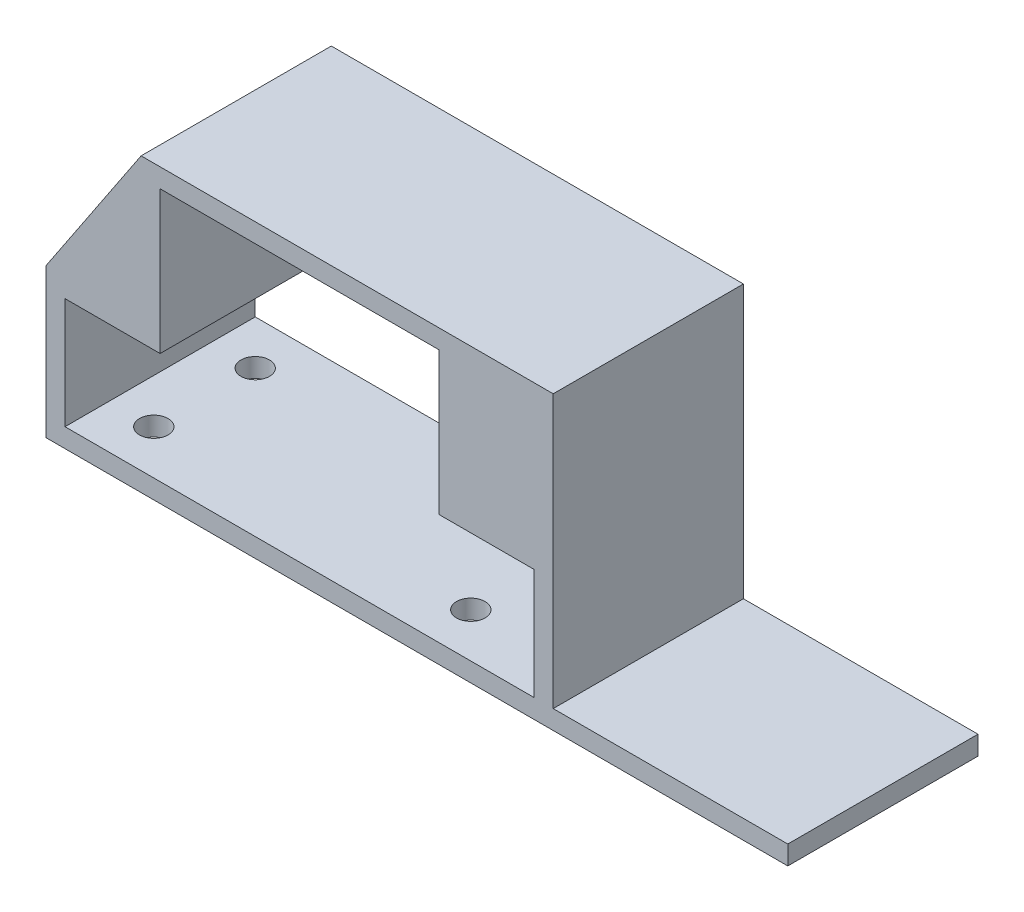
ISO-10303-21;
HEADER;
FILE_DESCRIPTION(('STEP AP214'),'2;1');
FILE_NAME('part.step','',(''),(''),'','','');
FILE_SCHEMA(('AUTOMOTIVE_DESIGN { 1 0 10303 214 1 1 1 1 }'));
ENDSEC;
DATA;
#1=APPLICATION_CONTEXT('core data for automotive mechanical design processes');
#2=APPLICATION_PROTOCOL_DEFINITION('international standard','automotive_design',2000,#1);
#3=PRODUCT_CONTEXT('',#1,'mechanical');
#4=PRODUCT('Part','Part','',(#3));
#5=PRODUCT_RELATED_PRODUCT_CATEGORY('part','',(#4));
#6=PRODUCT_DEFINITION_FORMATION('','',#4);
#7=PRODUCT_DEFINITION_CONTEXT('part definition',#1,'design');
#8=PRODUCT_DEFINITION('design','',#6,#7);
#9=PRODUCT_DEFINITION_SHAPE('','',#8);
#10=(LENGTH_UNIT() NAMED_UNIT(*) SI_UNIT(.MILLI.,.METRE.));
#11=(NAMED_UNIT(*) PLANE_ANGLE_UNIT() SI_UNIT($,.RADIAN.));
#12=(NAMED_UNIT(*) SI_UNIT($,.STERADIAN.) SOLID_ANGLE_UNIT());
#13=UNCERTAINTY_MEASURE_WITH_UNIT(LENGTH_MEASURE(1.E-05),#10,'distance_accuracy_value','');
#14=(GEOMETRIC_REPRESENTATION_CONTEXT(3) GLOBAL_UNCERTAINTY_ASSIGNED_CONTEXT((#13)) GLOBAL_UNIT_ASSIGNED_CONTEXT((#10,
#11,#12)) REPRESENTATION_CONTEXT('',''));
#15=CARTESIAN_POINT('',(0.,0.,0.));
#16=DIRECTION('',(0.,0.,1.));
#17=DIRECTION('',(1.,0.,0.));
#18=AXIS2_PLACEMENT_3D('',#15,#16,#17);
#19=CARTESIAN_POINT('',(0.,3.,0.));
#20=DIRECTION('',(0.,-1.,0.));
#21=DIRECTION('',(0.,0.,-1.));
#22=AXIS2_PLACEMENT_3D('',#19,#20,#21);
#23=PLANE('',#22);
#24=CARTESIAN_POINT('',(50.,3.,-16.));
#25=DIRECTION('',(0.,1.,0.));
#26=DIRECTION('',(0.,0.,1.));
#27=AXIS2_PLACEMENT_3D('',#24,#25,#26);
#28=CIRCLE('',#27,2.25);
#29=CARTESIAN_POINT('',(50.,3.,-13.75));
#30=VERTEX_POINT('',#29);
#31=EDGE_CURVE('E243',#30,#30,#28,.T.);
#32=ORIENTED_EDGE('',*,*,#31,.F.);
#33=EDGE_LOOP('',(#32));
#34=FACE_BOUND('',#33,.T.);
#35=CARTESIAN_POINT('',(50.,3.,0.));
#36=DIRECTION('',(0.,1.,0.));
#37=DIRECTION('',(0.,0.,1.));
#38=AXIS2_PLACEMENT_3D('',#35,#36,#37);
#39=CIRCLE('',#38,2.25);
#40=CARTESIAN_POINT('',(50.,3.,2.25));
#41=VERTEX_POINT('',#40);
#42=EDGE_CURVE('E249',#41,#41,#39,.T.);
#43=ORIENTED_EDGE('',*,*,#42,.F.);
#44=EDGE_LOOP('',(#43));
#45=FACE_BOUND('',#44,.T.);
#46=CARTESIAN_POINT('',(0.,3.,-16.));
#47=DIRECTION('',(0.,1.,0.));
#48=DIRECTION('',(0.,0.,1.));
#49=AXIS2_PLACEMENT_3D('',#46,#47,#48);
#50=CIRCLE('',#49,2.25);
#51=CARTESIAN_POINT('',(0.,3.,-13.75));
#52=VERTEX_POINT('',#51);
#53=EDGE_CURVE('E255',#52,#52,#50,.T.);
#54=ORIENTED_EDGE('',*,*,#53,.F.);
#55=EDGE_LOOP('',(#54));
#56=FACE_BOUND('',#55,.T.);
#57=CARTESIAN_POINT('',(0.,3.,0.));
#58=DIRECTION('',(0.,1.,0.));
#59=DIRECTION('',(0.,0.,1.));
#60=AXIS2_PLACEMENT_3D('',#57,#58,#59);
#61=CIRCLE('',#60,2.25);
#62=CARTESIAN_POINT('',(0.,3.,2.25));
#63=VERTEX_POINT('',#62);
#64=EDGE_CURVE('E261',#63,#63,#61,.T.);
#65=ORIENTED_EDGE('',*,*,#64,.F.);
#66=EDGE_LOOP('',(#65));
#67=FACE_BOUND('',#66,.T.);
#68=DIRECTION('',(1.,0.,0.));
#69=VECTOR('',#68,1.);
#70=CARTESIAN_POINT('',(57.,3.,7.));
#71=LINE('',#70,#69);
#72=CARTESIAN_POINT('',(-7.,3.,7.));
#73=VERTEX_POINT('',#72);
#74=CARTESIAN_POINT('',(66.9999998640001,3.,7.));
#75=VERTEX_POINT('',#74);
#76=EDGE_CURVE('E56',#73,#75,#71,.T.);
#77=ORIENTED_EDGE('',*,*,#76,.T.);
#78=DIRECTION('',(0.,0.,-1.));
#79=VECTOR('',#78,1.);
#80=CARTESIAN_POINT('',(66.9999998640001,3.,7.00000000000001));
#81=LINE('',#80,#79);
#82=CARTESIAN_POINT('',(66.9999998640001,3.,-23.));
#83=VERTEX_POINT('',#82);
#84=EDGE_CURVE('E236',#75,#83,#81,.T.);
#85=ORIENTED_EDGE('',*,*,#84,.T.);
#86=DIRECTION('',(-1.,0.,0.));
#87=VECTOR('',#86,1.);
#88=CARTESIAN_POINT('',(-7.,3.,-23.));
#89=LINE('',#88,#87);
#90=CARTESIAN_POINT('',(-7.,3.,-23.));
#91=VERTEX_POINT('',#90);
#92=EDGE_CURVE('E270',#83,#91,#89,.T.);
#93=ORIENTED_EDGE('',*,*,#92,.T.);
#94=DIRECTION('',(0.,0.,1.));
#95=VECTOR('',#94,1.);
#96=CARTESIAN_POINT('',(-7.,3.,-23.));
#97=LINE('',#96,#95);
#98=EDGE_CURVE('E269',#91,#73,#97,.T.);
#99=ORIENTED_EDGE('',*,*,#98,.T.);
#100=EDGE_LOOP('',(#77,#85,#93,#99));
#101=FACE_BOUND('',#100,.T.);
#102=ADVANCED_FACE('F33',(#34,#45,#56,#67,#101),#23,.F.);
#103=CARTESIAN_POINT('',(107.,3.,-23.));
#104=VERTEX_POINT('',#103);
#105=CARTESIAN_POINT('',(69.9999998640001,3.,-23.));
#106=VERTEX_POINT('',#105);
#107=EDGE_CURVE('E267',#104,#106,#89,.T.);
#108=ORIENTED_EDGE('',*,*,#107,.T.);
#109=DIRECTION('',(0.,0.,-1.));
#110=VECTOR('',#109,1.);
#111=CARTESIAN_POINT('',(69.9999998640001,3.,7.00000000000001));
#112=LINE('',#111,#110);
#113=CARTESIAN_POINT('',(69.9999998640001,3.,7.));
#114=VERTEX_POINT('',#113);
#115=EDGE_CURVE('E48',#114,#106,#112,.T.);
#116=ORIENTED_EDGE('',*,*,#115,.F.);
#117=CARTESIAN_POINT('',(107.,3.,7.));
#118=VERTEX_POINT('',#117);
#119=EDGE_CURVE('E272',#114,#118,#71,.T.);
#120=ORIENTED_EDGE('',*,*,#119,.T.);
#121=DIRECTION('',(0.,0.,-1.));
#122=VECTOR('',#121,1.);
#123=CARTESIAN_POINT('',(107.,3.,-23.));
#124=LINE('',#123,#122);
#125=EDGE_CURVE('E274',#118,#104,#124,.T.);
#126=ORIENTED_EDGE('',*,*,#125,.T.);
#127=EDGE_LOOP('',(#108,#116,#120,#126));
#128=FACE_BOUND('',#127,.T.);
#129=ADVANCED_FACE('F300',(#128),#23,.F.);
#130=CARTESIAN_POINT('',(0.,0.,0.));
#131=DIRECTION('',(0.,-1.,0.));
#132=DIRECTION('',(0.,0.,-1.));
#133=AXIS2_PLACEMENT_3D('',#130,#131,#132);
#134=PLANE('',#133);
#135=CARTESIAN_POINT('',(50.,0.,0.));
#136=DIRECTION('',(0.,1.,0.));
#137=DIRECTION('',(0.,0.,1.));
#138=AXIS2_PLACEMENT_3D('',#135,#136,#137);
#139=CIRCLE('',#138,2.25);
#140=CARTESIAN_POINT('',(50.,0.,2.25));
#141=VERTEX_POINT('',#140);
#142=EDGE_CURVE('E246',#141,#141,#139,.T.);
#143=ORIENTED_EDGE('',*,*,#142,.T.);
#144=EDGE_LOOP('',(#143));
#145=FACE_BOUND('',#144,.T.);
#146=CARTESIAN_POINT('',(0.,0.,0.));
#147=DIRECTION('',(0.,1.,0.));
#148=DIRECTION('',(0.,0.,1.));
#149=AXIS2_PLACEMENT_3D('',#146,#147,#148);
#150=CIRCLE('',#149,2.25);
#151=CARTESIAN_POINT('',(0.,0.,2.25));
#152=VERTEX_POINT('',#151);
#153=EDGE_CURVE('E258',#152,#152,#150,.T.);
#154=ORIENTED_EDGE('',*,*,#153,.T.);
#155=EDGE_LOOP('',(#154));
#156=FACE_BOUND('',#155,.T.);
#157=DIRECTION('',(1.,0.,0.));
#158=VECTOR('',#157,1.);
#159=CARTESIAN_POINT('',(107.,0.,7.));
#160=LINE('',#159,#158);
#161=CARTESIAN_POINT('',(-10.,0.,7.00000000000001));
#162=VERTEX_POINT('',#161);
#163=CARTESIAN_POINT('',(107.,0.,7.));
#164=VERTEX_POINT('',#163);
#165=EDGE_CURVE('E264',#162,#164,#160,.T.);
#166=ORIENTED_EDGE('',*,*,#165,.F.);
#167=DIRECTION('',(0.,0.,-1.));
#168=VECTOR('',#167,1.);
#169=CARTESIAN_POINT('',(-10.,0.,7.00000000000001));
#170=LINE('',#169,#168);
#171=CARTESIAN_POINT('',(-10.,0.,-23.));
#172=VERTEX_POINT('',#171);
#173=EDGE_CURVE('E152',#162,#172,#170,.T.);
#174=ORIENTED_EDGE('',*,*,#173,.T.);
#175=DIRECTION('',(-1.,0.,0.));
#176=VECTOR('',#175,1.);
#177=CARTESIAN_POINT('',(57.,0.,-23.));
#178=LINE('',#177,#176);
#179=CARTESIAN_POINT('',(107.,0.,-23.));
#180=VERTEX_POINT('',#179);
#181=EDGE_CURVE('E280',#180,#172,#178,.T.);
#182=ORIENTED_EDGE('',*,*,#181,.F.);
#183=DIRECTION('',(0.,0.,-1.));
#184=VECTOR('',#183,1.);
#185=CARTESIAN_POINT('',(107.,0.,-23.));
#186=LINE('',#185,#184);
#187=EDGE_CURVE('E278',#164,#180,#186,.T.);
#188=ORIENTED_EDGE('',*,*,#187,.F.);
#189=EDGE_LOOP('',(#166,#174,#182,#188));
#190=FACE_BOUND('',#189,.T.);
#191=CARTESIAN_POINT('',(0.,0.,-16.));
#192=DIRECTION('',(0.,1.,0.));
#193=DIRECTION('',(0.,0.,1.));
#194=AXIS2_PLACEMENT_3D('',#191,#192,#193);
#195=CIRCLE('',#194,2.25);
#196=CARTESIAN_POINT('',(0.,0.,-13.75));
#197=VERTEX_POINT('',#196);
#198=EDGE_CURVE('E252',#197,#197,#195,.T.);
#199=ORIENTED_EDGE('',*,*,#198,.T.);
#200=EDGE_LOOP('',(#199));
#201=FACE_BOUND('',#200,.T.);
#202=CARTESIAN_POINT('',(50.,0.,-16.));
#203=DIRECTION('',(0.,1.,0.));
#204=DIRECTION('',(0.,0.,1.));
#205=AXIS2_PLACEMENT_3D('',#202,#203,#204);
#206=CIRCLE('',#205,2.25);
#207=CARTESIAN_POINT('',(50.,0.,-13.75));
#208=VERTEX_POINT('',#207);
#209=EDGE_CURVE('E225',#208,#208,#206,.T.);
#210=ORIENTED_EDGE('',*,*,#209,.T.);
#211=EDGE_LOOP('',(#210));
#212=FACE_BOUND('',#211,.T.);
#213=ADVANCED_FACE('F291',(#145,#156,#190,#201,#212),#134,.T.);
#214=CARTESIAN_POINT('',(107.,3.,7.));
#215=DIRECTION('',(0.,0.,-1.));
#216=DIRECTION('',(-1.,0.,0.));
#217=AXIS2_PLACEMENT_3D('',#214,#215,#216);
#218=PLANE('',#217);
#219=DIRECTION('',(1.,0.,0.));
#220=VECTOR('',#219,1.);
#221=CARTESIAN_POINT('',(4.99999993199985,46.0000000350001,7.00000000000001));
#222=LINE('',#221,#220);
#223=CARTESIAN_POINT('',(4.99999993199985,46.0000000350001,7.00000000000001));
#224=VERTEX_POINT('',#223);
#225=CARTESIAN_POINT('',(69.9999998640001,46.0000000350001,7.00000000000001));
#226=VERTEX_POINT('',#225);
#227=EDGE_CURVE('E161',#224,#226,#222,.T.);
#228=ORIENTED_EDGE('',*,*,#227,.F.);
#229=DIRECTION('',(0.554700193886949,0.832050295896697,0.));
#230=VECTOR('',#229,1.);
#231=CARTESIAN_POINT('',(4.99999993199985,46.0000000350001,7.00000000000001));
#232=LINE('',#231,#230);
#233=CARTESIAN_POINT('',(-10.,23.5,7.00000000000001));
#234=VERTEX_POINT('',#233);
#235=EDGE_CURVE('E143',#234,#224,#232,.T.);
#236=ORIENTED_EDGE('',*,*,#235,.F.);
#237=DIRECTION('',(0.,1.,0.));
#238=VECTOR('',#237,1.);
#239=CARTESIAN_POINT('',(-10.,0.,7.00000000000001));
#240=LINE('',#239,#238);
#241=EDGE_CURVE('E158',#162,#234,#240,.T.);
#242=ORIENTED_EDGE('',*,*,#241,.F.);
#243=ORIENTED_EDGE('',*,*,#165,.T.);
#244=DIRECTION('',(0.,-1.,0.));
#245=VECTOR('',#244,1.);
#246=CARTESIAN_POINT('',(107.,3.,7.));
#247=LINE('',#246,#245);
#248=EDGE_CURVE('E11',#118,#164,#247,.T.);
#249=ORIENTED_EDGE('',*,*,#248,.F.);
#250=ORIENTED_EDGE('',*,*,#119,.F.);
#251=DIRECTION('',(0.,-1.,0.));
#252=VECTOR('',#251,1.);
#253=CARTESIAN_POINT('',(69.9999998640001,3.,7.00000000000001));
#254=LINE('',#253,#252);
#255=EDGE_CURVE('E169',#226,#114,#254,.T.);
#256=ORIENTED_EDGE('',*,*,#255,.F.);
#257=EDGE_LOOP('',(#228,#236,#242,#243,#249,#250,#256));
#258=FACE_BOUND('',#257,.T.);
#259=ORIENTED_EDGE('',*,*,#76,.F.);
#260=DIRECTION('',(0.,-1.,0.));
#261=VECTOR('',#260,1.);
#262=CARTESIAN_POINT('',(-7.,3.,7.00000000000001));
#263=LINE('',#262,#261);
#264=CARTESIAN_POINT('',(-7.,20.5,7.00000000000001));
#265=VERTEX_POINT('',#264);
#266=EDGE_CURVE('E167',#265,#73,#263,.T.);
#267=ORIENTED_EDGE('',*,*,#266,.F.);
#268=DIRECTION('',(-1.,0.,0.));
#269=VECTOR('',#268,1.);
#270=CARTESIAN_POINT('',(-7.,20.5,7.00000000000001));
#271=LINE('',#270,#269);
#272=CARTESIAN_POINT('',(7.99999993199985,20.5,7.00000000000001));
#273=VERTEX_POINT('',#272);
#274=EDGE_CURVE('E193',#273,#265,#271,.T.);
#275=ORIENTED_EDGE('',*,*,#274,.F.);
#276=DIRECTION('',(0.,-1.,0.));
#277=VECTOR('',#276,1.);
#278=CARTESIAN_POINT('',(7.99999993199985,43.0000000350001,7.00000000000001));
#279=LINE('',#278,#277);
#280=CARTESIAN_POINT('',(7.99999993199985,43.0000000350001,7.00000000000001));
#281=VERTEX_POINT('',#280);
#282=EDGE_CURVE('E190',#281,#273,#279,.T.);
#283=ORIENTED_EDGE('',*,*,#282,.F.);
#284=DIRECTION('',(-1.,0.,0.));
#285=VECTOR('',#284,1.);
#286=CARTESIAN_POINT('',(51.999999932,43.0000000350001,7.00000000000001));
#287=LINE('',#286,#285);
#288=CARTESIAN_POINT('',(51.999999932,43.0000000350001,7.00000000000001));
#289=VERTEX_POINT('',#288);
#290=EDGE_CURVE('E187',#289,#281,#287,.T.);
#291=ORIENTED_EDGE('',*,*,#290,.F.);
#292=DIRECTION('',(0.,1.,0.));
#293=VECTOR('',#292,1.);
#294=CARTESIAN_POINT('',(51.999999932,20.5,7.00000000000001));
#295=LINE('',#294,#293);
#296=CARTESIAN_POINT('',(51.999999932,20.5,7.00000000000001));
#297=VERTEX_POINT('',#296);
#298=EDGE_CURVE('E184',#297,#289,#295,.T.);
#299=ORIENTED_EDGE('',*,*,#298,.F.);
#300=DIRECTION('',(-1.,0.,0.));
#301=VECTOR('',#300,1.);
#302=CARTESIAN_POINT('',(51.999999932,20.5,7.00000000000001));
#303=LINE('',#302,#301);
#304=CARTESIAN_POINT('',(66.9999998640001,20.5,7.00000000000001));
#305=VERTEX_POINT('',#304);
#306=EDGE_CURVE('E181',#305,#297,#303,.T.);
#307=ORIENTED_EDGE('',*,*,#306,.F.);
#308=DIRECTION('',(0.,1.,0.));
#309=VECTOR('',#308,1.);
#310=CARTESIAN_POINT('',(66.9999998640001,20.5,7.00000000000001));
#311=LINE('',#310,#309);
#312=EDGE_CURVE('E178',#75,#305,#311,.T.);
#313=ORIENTED_EDGE('',*,*,#312,.F.);
#314=EDGE_LOOP('',(#259,#267,#275,#283,#291,#299,#307,#313));
#315=FACE_BOUND('',#314,.T.);
#316=ADVANCED_FACE('F35',(#258,#315),#218,.F.);
#317=CARTESIAN_POINT('',(107.,3.,-23.));
#318=DIRECTION('',(-1.,0.,0.));
#319=DIRECTION('',(0.,0.,1.));
#320=AXIS2_PLACEMENT_3D('',#317,#318,#319);
#321=PLANE('',#320);
#322=ORIENTED_EDGE('',*,*,#187,.T.);
#323=DIRECTION('',(0.,-1.,0.));
#324=VECTOR('',#323,1.);
#325=CARTESIAN_POINT('',(107.,3.,-23.));
#326=LINE('',#325,#324);
#327=EDGE_CURVE('E41',#104,#180,#326,.T.);
#328=ORIENTED_EDGE('',*,*,#327,.F.);
#329=ORIENTED_EDGE('',*,*,#125,.F.);
#330=ORIENTED_EDGE('',*,*,#248,.T.);
#331=EDGE_LOOP('',(#322,#328,#329,#330));
#332=FACE_BOUND('',#331,.T.);
#333=ADVANCED_FACE('F301',(#332),#321,.F.);
#334=CARTESIAN_POINT('',(57.,3.,-23.));
#335=DIRECTION('',(0.,0.,1.));
#336=DIRECTION('',(1.,0.,0.));
#337=AXIS2_PLACEMENT_3D('',#334,#335,#336);
#338=PLANE('',#337);
#339=DIRECTION('',(0.554700193886949,0.832050295896697,0.));
#340=VECTOR('',#339,1.);
#341=CARTESIAN_POINT('',(4.99999993199985,46.0000000350001,-23.));
#342=LINE('',#341,#340);
#343=CARTESIAN_POINT('',(-10.,23.5,-23.));
#344=VERTEX_POINT('',#343);
#345=CARTESIAN_POINT('',(4.99999993199985,46.0000000350001,-23.));
#346=VERTEX_POINT('',#345);
#347=EDGE_CURVE('E146',#344,#346,#342,.T.);
#348=ORIENTED_EDGE('',*,*,#347,.T.);
#349=DIRECTION('',(1.,0.,0.));
#350=VECTOR('',#349,1.);
#351=CARTESIAN_POINT('',(4.99999993199985,46.0000000350001,-23.));
#352=LINE('',#351,#350);
#353=CARTESIAN_POINT('',(69.9999998640001,46.0000000350001,-23.));
#354=VERTEX_POINT('',#353);
#355=EDGE_CURVE('E197',#346,#354,#352,.T.);
#356=ORIENTED_EDGE('',*,*,#355,.T.);
#357=DIRECTION('',(0.,-1.,0.));
#358=VECTOR('',#357,1.);
#359=CARTESIAN_POINT('',(69.9999998640001,3.,-23.));
#360=LINE('',#359,#358);
#361=EDGE_CURVE('E200',#354,#106,#360,.T.);
#362=ORIENTED_EDGE('',*,*,#361,.T.);
#363=ORIENTED_EDGE('',*,*,#107,.F.);
#364=ORIENTED_EDGE('',*,*,#327,.T.);
#365=ORIENTED_EDGE('',*,*,#181,.T.);
#366=DIRECTION('',(0.,1.,0.));
#367=VECTOR('',#366,1.);
#368=CARTESIAN_POINT('',(-10.,0.,-23.));
#369=LINE('',#368,#367);
#370=EDGE_CURVE('E162',#172,#344,#369,.T.);
#371=ORIENTED_EDGE('',*,*,#370,.T.);
#372=EDGE_LOOP('',(#348,#356,#362,#363,#364,#365,#371));
#373=FACE_BOUND('',#372,.T.);
#374=DIRECTION('',(0.,-1.,0.));
#375=VECTOR('',#374,1.);
#376=CARTESIAN_POINT('',(-7.,3.,-23.));
#377=LINE('',#376,#375);
#378=CARTESIAN_POINT('',(-7.,20.5,-23.));
#379=VERTEX_POINT('',#378);
#380=EDGE_CURVE('E172',#379,#91,#377,.T.);
#381=ORIENTED_EDGE('',*,*,#380,.T.);
#382=ORIENTED_EDGE('',*,*,#92,.F.);
#383=DIRECTION('',(0.,1.,0.));
#384=VECTOR('',#383,1.);
#385=CARTESIAN_POINT('',(66.9999998640001,20.5,-23.));
#386=LINE('',#385,#384);
#387=CARTESIAN_POINT('',(66.9999998640001,20.5,-23.));
#388=VERTEX_POINT('',#387);
#389=EDGE_CURVE('E203',#83,#388,#386,.T.);
#390=ORIENTED_EDGE('',*,*,#389,.T.);
#391=DIRECTION('',(-1.,0.,0.));
#392=VECTOR('',#391,1.);
#393=CARTESIAN_POINT('',(51.999999932,20.5,-23.));
#394=LINE('',#393,#392);
#395=CARTESIAN_POINT('',(51.999999932,20.5,-23.));
#396=VERTEX_POINT('',#395);
#397=EDGE_CURVE('E206',#388,#396,#394,.T.);
#398=ORIENTED_EDGE('',*,*,#397,.T.);
#399=DIRECTION('',(0.,1.,0.));
#400=VECTOR('',#399,1.);
#401=CARTESIAN_POINT('',(51.999999932,20.5,-23.));
#402=LINE('',#401,#400);
#403=CARTESIAN_POINT('',(51.999999932,43.0000000350001,-23.));
#404=VERTEX_POINT('',#403);
#405=EDGE_CURVE('E209',#396,#404,#402,.T.);
#406=ORIENTED_EDGE('',*,*,#405,.T.);
#407=DIRECTION('',(-1.,0.,0.));
#408=VECTOR('',#407,1.);
#409=CARTESIAN_POINT('',(51.999999932,43.0000000350001,-23.));
#410=LINE('',#409,#408);
#411=CARTESIAN_POINT('',(7.99999993199985,43.0000000350001,-23.));
#412=VERTEX_POINT('',#411);
#413=EDGE_CURVE('E212',#404,#412,#410,.T.);
#414=ORIENTED_EDGE('',*,*,#413,.T.);
#415=DIRECTION('',(0.,-1.,0.));
#416=VECTOR('',#415,1.);
#417=CARTESIAN_POINT('',(7.99999993199985,43.0000000350001,-23.));
#418=LINE('',#417,#416);
#419=CARTESIAN_POINT('',(7.99999993199985,20.5,-23.));
#420=VERTEX_POINT('',#419);
#421=EDGE_CURVE('E215',#412,#420,#418,.T.);
#422=ORIENTED_EDGE('',*,*,#421,.T.);
#423=DIRECTION('',(-1.,0.,0.));
#424=VECTOR('',#423,1.);
#425=CARTESIAN_POINT('',(-7.,20.5,-23.));
#426=LINE('',#425,#424);
#427=EDGE_CURVE('E218',#420,#379,#426,.T.);
#428=ORIENTED_EDGE('',*,*,#427,.T.);
#429=EDGE_LOOP('',(#381,#382,#390,#398,#406,#414,#422,#428));
#430=FACE_BOUND('',#429,.T.);
#431=ADVANCED_FACE('F285',(#373,#430),#338,.F.);
#432=CARTESIAN_POINT('',(0.,3.,0.));
#433=DIRECTION('',(0.,-1.,0.));
#434=DIRECTION('',(0.,0.,-1.));
#435=AXIS2_PLACEMENT_3D('',#432,#433,#434);
#436=CYLINDRICAL_SURFACE('',#435,2.25);
#437=ORIENTED_EDGE('',*,*,#64,.T.);
#438=EDGE_LOOP('',(#437));
#439=FACE_BOUND('',#438,.T.);
#440=ORIENTED_EDGE('',*,*,#153,.F.);
#441=EDGE_LOOP('',(#440));
#442=FACE_BOUND('',#441,.T.);
#443=ADVANCED_FACE('F307',(#439,#442),#436,.F.);
#444=CARTESIAN_POINT('',(0.,3.,-16.));
#445=DIRECTION('',(0.,-1.,0.));
#446=DIRECTION('',(0.,0.,-1.));
#447=AXIS2_PLACEMENT_3D('',#444,#445,#446);
#448=CYLINDRICAL_SURFACE('',#447,2.25);
#449=ORIENTED_EDGE('',*,*,#53,.T.);
#450=EDGE_LOOP('',(#449));
#451=FACE_BOUND('',#450,.T.);
#452=ORIENTED_EDGE('',*,*,#198,.F.);
#453=EDGE_LOOP('',(#452));
#454=FACE_BOUND('',#453,.T.);
#455=ADVANCED_FACE('F329',(#451,#454),#448,.F.);
#456=CARTESIAN_POINT('',(50.,3.,0.));
#457=DIRECTION('',(0.,-1.,0.));
#458=DIRECTION('',(0.,0.,-1.));
#459=AXIS2_PLACEMENT_3D('',#456,#457,#458);
#460=CYLINDRICAL_SURFACE('',#459,2.25);
#461=ORIENTED_EDGE('',*,*,#42,.T.);
#462=EDGE_LOOP('',(#461));
#463=FACE_BOUND('',#462,.T.);
#464=ORIENTED_EDGE('',*,*,#142,.F.);
#465=EDGE_LOOP('',(#464));
#466=FACE_BOUND('',#465,.T.);
#467=ADVANCED_FACE('F334',(#463,#466),#460,.F.);
#468=CARTESIAN_POINT('',(50.,3.,-16.));
#469=DIRECTION('',(0.,-1.,0.));
#470=DIRECTION('',(0.,0.,-1.));
#471=AXIS2_PLACEMENT_3D('',#468,#469,#470);
#472=CYLINDRICAL_SURFACE('',#471,2.25);
#473=ORIENTED_EDGE('',*,*,#31,.T.);
#474=EDGE_LOOP('',(#473));
#475=FACE_BOUND('',#474,.T.);
#476=ORIENTED_EDGE('',*,*,#209,.F.);
#477=EDGE_LOOP('',(#476));
#478=FACE_BOUND('',#477,.T.);
#479=ADVANCED_FACE('F341',(#475,#478),#472,.F.);
#480=CARTESIAN_POINT('',(-7.,3.,7.00000000000001));
#481=DIRECTION('',(1.,0.,0.));
#482=DIRECTION('',(0.,0.,-1.));
#483=AXIS2_PLACEMENT_3D('',#480,#481,#482);
#484=PLANE('',#483);
#485=ORIENTED_EDGE('',*,*,#98,.F.);
#486=ORIENTED_EDGE('',*,*,#380,.F.);
#487=DIRECTION('',(0.,0.,-1.));
#488=VECTOR('',#487,1.);
#489=CARTESIAN_POINT('',(-7.,20.5,7.00000000000001));
#490=LINE('',#489,#488);
#491=EDGE_CURVE('E223',#265,#379,#490,.T.);
#492=ORIENTED_EDGE('',*,*,#491,.F.);
#493=ORIENTED_EDGE('',*,*,#266,.T.);
#494=EDGE_LOOP('',(#485,#486,#492,#493));
#495=FACE_BOUND('',#494,.T.);
#496=ADVANCED_FACE('F348',(#495),#484,.T.);
#497=CARTESIAN_POINT('',(-7.,20.5,7.00000000000001));
#498=DIRECTION('',(0.,-1.,0.));
#499=DIRECTION('',(1.,0.,0.));
#500=AXIS2_PLACEMENT_3D('',#497,#498,#499);
#501=PLANE('',#500);
#502=ORIENTED_EDGE('',*,*,#427,.F.);
#503=DIRECTION('',(0.,0.,-1.));
#504=VECTOR('',#503,1.);
#505=CARTESIAN_POINT('',(7.99999993199985,20.5,7.00000000000001));
#506=LINE('',#505,#504);
#507=EDGE_CURVE('E226',#273,#420,#506,.T.);
#508=ORIENTED_EDGE('',*,*,#507,.F.);
#509=ORIENTED_EDGE('',*,*,#274,.T.);
#510=ORIENTED_EDGE('',*,*,#491,.T.);
#511=EDGE_LOOP('',(#502,#508,#509,#510));
#512=FACE_BOUND('',#511,.T.);
#513=ADVANCED_FACE('F375',(#512),#501,.T.);
#514=CARTESIAN_POINT('',(7.99999993199985,43.0000000350001,7.00000000000001));
#515=DIRECTION('',(1.,0.,0.));
#516=DIRECTION('',(0.,0.,-1.));
#517=AXIS2_PLACEMENT_3D('',#514,#515,#516);
#518=PLANE('',#517);
#519=ORIENTED_EDGE('',*,*,#421,.F.);
#520=DIRECTION('',(0.,0.,-1.));
#521=VECTOR('',#520,1.);
#522=CARTESIAN_POINT('',(7.99999993199985,43.0000000350001,7.00000000000001));
#523=LINE('',#522,#521);
#524=EDGE_CURVE('E228',#281,#412,#523,.T.);
#525=ORIENTED_EDGE('',*,*,#524,.F.);
#526=ORIENTED_EDGE('',*,*,#282,.T.);
#527=ORIENTED_EDGE('',*,*,#507,.T.);
#528=EDGE_LOOP('',(#519,#525,#526,#527));
#529=FACE_BOUND('',#528,.T.);
#530=ADVANCED_FACE('F371',(#529),#518,.T.);
#531=CARTESIAN_POINT('',(51.999999932,43.0000000350001,7.00000000000001));
#532=DIRECTION('',(0.,-1.,0.));
#533=DIRECTION('',(0.,0.,-1.));
#534=AXIS2_PLACEMENT_3D('',#531,#532,#533);
#535=PLANE('',#534);
#536=ORIENTED_EDGE('',*,*,#413,.F.);
#537=DIRECTION('',(0.,0.,-1.));
#538=VECTOR('',#537,1.);
#539=CARTESIAN_POINT('',(51.999999932,43.0000000350001,7.00000000000001));
#540=LINE('',#539,#538);
#541=EDGE_CURVE('E230',#289,#404,#540,.T.);
#542=ORIENTED_EDGE('',*,*,#541,.F.);
#543=ORIENTED_EDGE('',*,*,#290,.T.);
#544=ORIENTED_EDGE('',*,*,#524,.T.);
#545=EDGE_LOOP('',(#536,#542,#543,#544));
#546=FACE_BOUND('',#545,.T.);
#547=ADVANCED_FACE('F367',(#546),#535,.T.);
#548=CARTESIAN_POINT('',(51.999999932,20.5,7.00000000000001));
#549=DIRECTION('',(-1.,0.,0.));
#550=DIRECTION('',(0.,0.,1.));
#551=AXIS2_PLACEMENT_3D('',#548,#549,#550);
#552=PLANE('',#551);
#553=ORIENTED_EDGE('',*,*,#405,.F.);
#554=DIRECTION('',(0.,0.,-1.));
#555=VECTOR('',#554,1.);
#556=CARTESIAN_POINT('',(51.999999932,20.5,7.00000000000001));
#557=LINE('',#556,#555);
#558=EDGE_CURVE('E232',#297,#396,#557,.T.);
#559=ORIENTED_EDGE('',*,*,#558,.F.);
#560=ORIENTED_EDGE('',*,*,#298,.T.);
#561=ORIENTED_EDGE('',*,*,#541,.T.);
#562=EDGE_LOOP('',(#553,#559,#560,#561));
#563=FACE_BOUND('',#562,.T.);
#564=ADVANCED_FACE('F363',(#563),#552,.T.);
#565=CARTESIAN_POINT('',(51.999999932,20.5,7.00000000000001));
#566=DIRECTION('',(0.,-1.,0.));
#567=DIRECTION('',(1.,0.,0.));
#568=AXIS2_PLACEMENT_3D('',#565,#566,#567);
#569=PLANE('',#568);
#570=ORIENTED_EDGE('',*,*,#397,.F.);
#571=DIRECTION('',(0.,0.,-1.));
#572=VECTOR('',#571,1.);
#573=CARTESIAN_POINT('',(66.9999998640001,20.5,7.00000000000001));
#574=LINE('',#573,#572);
#575=EDGE_CURVE('E234',#305,#388,#574,.T.);
#576=ORIENTED_EDGE('',*,*,#575,.F.);
#577=ORIENTED_EDGE('',*,*,#306,.T.);
#578=ORIENTED_EDGE('',*,*,#558,.T.);
#579=EDGE_LOOP('',(#570,#576,#577,#578));
#580=FACE_BOUND('',#579,.T.);
#581=ADVANCED_FACE('F359',(#580),#569,.T.);
#582=CARTESIAN_POINT('',(66.9999998640001,20.5,7.00000000000001));
#583=DIRECTION('',(-1.,0.,0.));
#584=DIRECTION('',(0.,0.,1.));
#585=AXIS2_PLACEMENT_3D('',#582,#583,#584);
#586=PLANE('',#585);
#587=ORIENTED_EDGE('',*,*,#389,.F.);
#588=ORIENTED_EDGE('',*,*,#84,.F.);
#589=ORIENTED_EDGE('',*,*,#312,.T.);
#590=ORIENTED_EDGE('',*,*,#575,.T.);
#591=EDGE_LOOP('',(#587,#588,#589,#590));
#592=FACE_BOUND('',#591,.T.);
#593=ADVANCED_FACE('F356',(#592),#586,.T.);
#594=CARTESIAN_POINT('',(69.9999998640001,3.,7.00000000000001));
#595=DIRECTION('',(1.,0.,0.));
#596=DIRECTION('',(0.,0.,-1.));
#597=AXIS2_PLACEMENT_3D('',#594,#595,#596);
#598=PLANE('',#597);
#599=ORIENTED_EDGE('',*,*,#361,.F.);
#600=DIRECTION('',(0.,0.,-1.));
#601=VECTOR('',#600,1.);
#602=CARTESIAN_POINT('',(69.9999998640001,46.0000000350001,7.00000000000001));
#603=LINE('',#602,#601);
#604=EDGE_CURVE('E239',#226,#354,#603,.T.);
#605=ORIENTED_EDGE('',*,*,#604,.F.);
#606=ORIENTED_EDGE('',*,*,#255,.T.);
#607=ORIENTED_EDGE('',*,*,#115,.T.);
#608=EDGE_LOOP('',(#599,#605,#606,#607));
#609=FACE_BOUND('',#608,.T.);
#610=ADVANCED_FACE('F298',(#609),#598,.T.);
#611=CARTESIAN_POINT('',(4.99999993199985,46.0000000350001,7.00000000000001));
#612=DIRECTION('',(0.,1.,0.));
#613=DIRECTION('',(-1.,0.,0.));
#614=AXIS2_PLACEMENT_3D('',#611,#612,#613);
#615=PLANE('',#614);
#616=ORIENTED_EDGE('',*,*,#355,.F.);
#617=DIRECTION('',(0.,0.,-1.));
#618=VECTOR('',#617,1.);
#619=CARTESIAN_POINT('',(4.99999993199985,46.0000000350001,7.00000000000001));
#620=LINE('',#619,#618);
#621=EDGE_CURVE('E151',#224,#346,#620,.T.);
#622=ORIENTED_EDGE('',*,*,#621,.F.);
#623=ORIENTED_EDGE('',*,*,#227,.T.);
#624=ORIENTED_EDGE('',*,*,#604,.T.);
#625=EDGE_LOOP('',(#616,#622,#623,#624));
#626=FACE_BOUND('',#625,.T.);
#627=ADVANCED_FACE('F295',(#626),#615,.T.);
#628=CARTESIAN_POINT('',(-10.,0.,7.00000000000001));
#629=DIRECTION('',(-1.,0.,0.));
#630=DIRECTION('',(0.,0.,1.));
#631=AXIS2_PLACEMENT_3D('',#628,#629,#630);
#632=PLANE('',#631);
#633=ORIENTED_EDGE('',*,*,#370,.F.);
#634=ORIENTED_EDGE('',*,*,#173,.F.);
#635=ORIENTED_EDGE('',*,*,#241,.T.);
#636=DIRECTION('',(0.,0.,-1.));
#637=VECTOR('',#636,1.);
#638=CARTESIAN_POINT('',(-10.,23.5,7.00000000000001));
#639=LINE('',#638,#637);
#640=EDGE_CURVE('E140',#234,#344,#639,.T.);
#641=ORIENTED_EDGE('',*,*,#640,.T.);
#642=EDGE_LOOP('',(#633,#634,#635,#641));
#643=FACE_BOUND('',#642,.T.);
#644=ADVANCED_FACE('F165',(#643),#632,.T.);
#645=CARTESIAN_POINT('',(4.99999993199985,46.0000000350001,7.00000000000001));
#646=DIRECTION('',(-0.832050295896697,0.554700193886949,0.));
#647=DIRECTION('',(-0.554700193886949,-0.832050295896697,0.));
#648=AXIS2_PLACEMENT_3D('',#645,#646,#647);
#649=PLANE('',#648);
#650=ORIENTED_EDGE('',*,*,#347,.F.);
#651=ORIENTED_EDGE('',*,*,#640,.F.);
#652=ORIENTED_EDGE('',*,*,#235,.T.);
#653=ORIENTED_EDGE('',*,*,#621,.T.);
#654=EDGE_LOOP('',(#650,#651,#652,#653));
#655=FACE_BOUND('',#654,.T.);
#656=ADVANCED_FACE('F142',(#655),#649,.T.);
#657=CLOSED_SHELL('',(#102,#129,#213,#316,#333,#431,#443,#455,#467,#479,#496,#513,#530,#547,
#564,#581,#593,#610,#627,#644,#656));
#658=MANIFOLD_SOLID_BREP('B2',#657);
#659=ADVANCED_BREP_SHAPE_REPRESENTATION('',(#18,#658),#14);
#660=SHAPE_DEFINITION_REPRESENTATION(#9,#659);
ENDSEC;
END-ISO-10303-21;
